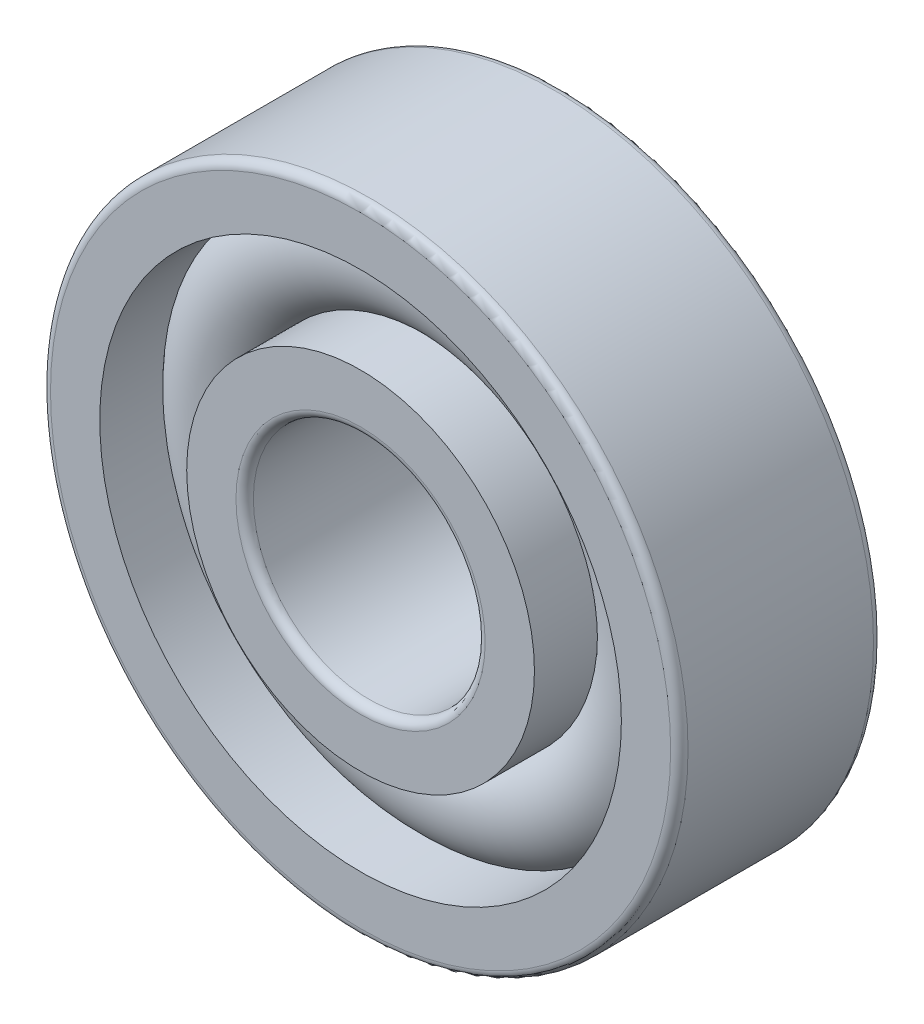
ISO-10303-21;
HEADER;
FILE_DESCRIPTION(('STEP AP214'),'2;1');
FILE_NAME('part.step','',(''),(''),'','','');
FILE_SCHEMA(('AUTOMOTIVE_DESIGN { 1 0 10303 214 1 1 1 1 }'));
ENDSEC;
DATA;
#1=APPLICATION_CONTEXT('core data for automotive mechanical design processes');
#2=APPLICATION_PROTOCOL_DEFINITION('international standard','automotive_design',2000,#1);
#3=PRODUCT_CONTEXT('',#1,'mechanical');
#4=PRODUCT('Part','Part','',(#3));
#5=PRODUCT_RELATED_PRODUCT_CATEGORY('part','',(#4));
#6=PRODUCT_DEFINITION_FORMATION('','',#4);
#7=PRODUCT_DEFINITION_CONTEXT('part definition',#1,'design');
#8=PRODUCT_DEFINITION('design','',#6,#7);
#9=PRODUCT_DEFINITION_SHAPE('','',#8);
#10=(LENGTH_UNIT() NAMED_UNIT(*) SI_UNIT(.MILLI.,.METRE.));
#11=(NAMED_UNIT(*) PLANE_ANGLE_UNIT() SI_UNIT($,.RADIAN.));
#12=(NAMED_UNIT(*) SI_UNIT($,.STERADIAN.) SOLID_ANGLE_UNIT());
#13=UNCERTAINTY_MEASURE_WITH_UNIT(LENGTH_MEASURE(1.E-05),#10,'distance_accuracy_value','');
#14=(GEOMETRIC_REPRESENTATION_CONTEXT(3) GLOBAL_UNCERTAINTY_ASSIGNED_CONTEXT((#13)) GLOBAL_UNIT_ASSIGNED_CONTEXT((#10,
#11,#12)) REPRESENTATION_CONTEXT('',''));
#15=CARTESIAN_POINT('',(0.,0.,0.));
#16=DIRECTION('',(0.,0.,1.));
#17=DIRECTION('',(1.,0.,0.));
#18=AXIS2_PLACEMENT_3D('',#15,#16,#17);
#19=CARTESIAN_POINT('',(0.,0.,0.));
#20=DIRECTION('',(0.,0.,1.));
#21=DIRECTION('',(1.,0.,0.));
#22=AXIS2_PLACEMENT_3D('',#19,#20,#21);
#23=CYLINDRICAL_SURFACE('',#22,6.);
#24=CARTESIAN_POINT('',(0.,0.,3.5));
#25=DIRECTION('',(0.,0.,1.));
#26=DIRECTION('',(1.,0.,0.));
#27=AXIS2_PLACEMENT_3D('',#24,#25,#26);
#28=CIRCLE('',#27,6.);
#29=CARTESIAN_POINT('',(6.,0.,3.5));
#30=VERTEX_POINT('',#29);
#31=EDGE_CURVE('E10',#30,#30,#28,.T.);
#32=ORIENTED_EDGE('',*,*,#31,.F.);
#33=EDGE_LOOP('',(#32));
#34=FACE_BOUND('',#33,.T.);
#35=CARTESIAN_POINT('',(0.,0.,1.3228756555323));
#36=DIRECTION('',(0.,0.,1.));
#37=DIRECTION('',(1.,0.,0.));
#38=AXIS2_PLACEMENT_3D('',#35,#36,#37);
#39=CIRCLE('',#38,6.);
#40=CARTESIAN_POINT('',(6.,0.,1.3228756555323));
#41=VERTEX_POINT('',#40);
#42=EDGE_CURVE('E91',#41,#41,#39,.T.);
#43=ORIENTED_EDGE('',*,*,#42,.T.);
#44=EDGE_LOOP('',(#43));
#45=FACE_BOUND('',#44,.T.);
#46=ADVANCED_FACE('F35',(#34,#45),#23,.T.);
#47=CARTESIAN_POINT('',(0.,6.,3.5));
#48=DIRECTION('',(0.,0.,-1.));
#49=DIRECTION('',(-1.,0.,0.));
#50=AXIS2_PLACEMENT_3D('',#47,#48,#49);
#51=PLANE('',#50);
#52=CARTESIAN_POINT('',(0.,0.,3.5));
#53=DIRECTION('',(0.,0.,1.));
#54=DIRECTION('',(1.,0.,0.));
#55=AXIS2_PLACEMENT_3D('',#52,#53,#54);
#56=CIRCLE('',#55,4.3);
#57=CARTESIAN_POINT('',(4.3,0.,3.5));
#58=VERTEX_POINT('',#57);
#59=EDGE_CURVE('E41',#58,#58,#56,.T.);
#60=ORIENTED_EDGE('',*,*,#59,.F.);
#61=EDGE_LOOP('',(#60));
#62=FACE_BOUND('',#61,.T.);
#63=ORIENTED_EDGE('',*,*,#31,.T.);
#64=EDGE_LOOP('',(#63));
#65=FACE_BOUND('',#64,.T.);
#66=ADVANCED_FACE('F176',(#62,#65),#51,.F.);
#67=CARTESIAN_POINT('',(0.,0.,3.2));
#68=DIRECTION('',(0.,0.,1.));
#69=DIRECTION('',(1.,0.,0.));
#70=AXIS2_PLACEMENT_3D('',#67,#68,#69);
#71=TOROIDAL_SURFACE('',#70,4.3,0.3);
#72=CARTESIAN_POINT('',(0.,0.,3.2));
#73=DIRECTION('',(0.,0.,1.));
#74=DIRECTION('',(1.,0.,0.));
#75=AXIS2_PLACEMENT_3D('',#72,#73,#74);
#76=CIRCLE('',#75,4.);
#77=CARTESIAN_POINT('',(4.,0.,3.2));
#78=VERTEX_POINT('',#77);
#79=EDGE_CURVE('E45',#78,#78,#76,.T.);
#80=ORIENTED_EDGE('',*,*,#79,.F.);
#81=EDGE_LOOP('',(#80));
#82=FACE_BOUND('',#81,.T.);
#83=ORIENTED_EDGE('',*,*,#59,.T.);
#84=EDGE_LOOP('',(#83));
#85=FACE_BOUND('',#84,.T.);
#86=ADVANCED_FACE('F171',(#82,#85),#71,.T.);
#87=CARTESIAN_POINT('',(0.,0.,0.));
#88=DIRECTION('',(0.,0.,1.));
#89=DIRECTION('',(1.,0.,0.));
#90=AXIS2_PLACEMENT_3D('',#87,#88,#89);
#91=CYLINDRICAL_SURFACE('',#90,4.);
#92=CARTESIAN_POINT('',(0.,0.,-3.2));
#93=DIRECTION('',(0.,0.,1.));
#94=DIRECTION('',(1.,0.,0.));
#95=AXIS2_PLACEMENT_3D('',#92,#93,#94);
#96=CIRCLE('',#95,4.);
#97=CARTESIAN_POINT('',(4.,0.,-3.2));
#98=VERTEX_POINT('',#97);
#99=EDGE_CURVE('E49',#98,#98,#96,.T.);
#100=ORIENTED_EDGE('',*,*,#99,.F.);
#101=EDGE_LOOP('',(#100));
#102=FACE_BOUND('',#101,.T.);
#103=ORIENTED_EDGE('',*,*,#79,.T.);
#104=EDGE_LOOP('',(#103));
#105=FACE_BOUND('',#104,.T.);
#106=ADVANCED_FACE('F165',(#102,#105),#91,.F.);
#107=CARTESIAN_POINT('',(0.,0.,-3.2));
#108=DIRECTION('',(0.,0.,1.));
#109=DIRECTION('',(1.,0.,0.));
#110=AXIS2_PLACEMENT_3D('',#107,#108,#109);
#111=TOROIDAL_SURFACE('',#110,4.3,0.3);
#112=CARTESIAN_POINT('',(0.,0.,-3.5));
#113=DIRECTION('',(0.,0.,1.));
#114=DIRECTION('',(1.,0.,0.));
#115=AXIS2_PLACEMENT_3D('',#112,#113,#114);
#116=CIRCLE('',#115,4.3);
#117=CARTESIAN_POINT('',(4.3,0.,-3.5));
#118=VERTEX_POINT('',#117);
#119=EDGE_CURVE('E54',#118,#118,#116,.T.);
#120=ORIENTED_EDGE('',*,*,#119,.F.);
#121=EDGE_LOOP('',(#120));
#122=FACE_BOUND('',#121,.T.);
#123=ORIENTED_EDGE('',*,*,#99,.T.);
#124=EDGE_LOOP('',(#123));
#125=FACE_BOUND('',#124,.T.);
#126=ADVANCED_FACE('F159',(#122,#125),#111,.T.);
#127=CARTESIAN_POINT('',(0.,4.3,-3.5));
#128=DIRECTION('',(0.,0.,1.));
#129=DIRECTION('',(1.,0.,0.));
#130=AXIS2_PLACEMENT_3D('',#127,#128,#129);
#131=PLANE('',#130);
#132=CARTESIAN_POINT('',(0.,0.,-3.5));
#133=DIRECTION('',(0.,0.,1.));
#134=DIRECTION('',(1.,0.,0.));
#135=AXIS2_PLACEMENT_3D('',#132,#133,#134);
#136=CIRCLE('',#135,6.);
#137=CARTESIAN_POINT('',(6.,0.,-3.5));
#138=VERTEX_POINT('',#137);
#139=EDGE_CURVE('E57',#138,#138,#136,.T.);
#140=ORIENTED_EDGE('',*,*,#139,.F.);
#141=EDGE_LOOP('',(#140));
#142=FACE_BOUND('',#141,.T.);
#143=ORIENTED_EDGE('',*,*,#119,.T.);
#144=EDGE_LOOP('',(#143));
#145=FACE_BOUND('',#144,.T.);
#146=ADVANCED_FACE('F153',(#142,#145),#131,.F.);
#147=CARTESIAN_POINT('',(0.,0.,0.));
#148=DIRECTION('',(0.,0.,1.));
#149=DIRECTION('',(1.,0.,0.));
#150=AXIS2_PLACEMENT_3D('',#147,#148,#149);
#151=CYLINDRICAL_SURFACE('',#150,6.);
#152=CARTESIAN_POINT('',(0.,0.,-1.3228756555323));
#153=DIRECTION('',(0.,0.,1.));
#154=DIRECTION('',(1.,0.,0.));
#155=AXIS2_PLACEMENT_3D('',#152,#153,#154);
#156=CIRCLE('',#155,6.);
#157=CARTESIAN_POINT('',(6.,0.,-1.3228756555323));
#158=VERTEX_POINT('',#157);
#159=EDGE_CURVE('E60',#158,#158,#156,.T.);
#160=ORIENTED_EDGE('',*,*,#159,.F.);
#161=EDGE_LOOP('',(#160));
#162=FACE_BOUND('',#161,.T.);
#163=ORIENTED_EDGE('',*,*,#139,.T.);
#164=EDGE_LOOP('',(#163));
#165=FACE_BOUND('',#164,.T.);
#166=ADVANCED_FACE('F147',(#162,#165),#151,.T.);
#167=CARTESIAN_POINT('',(0.,0.,0.));
#168=DIRECTION('',(0.,0.,1.));
#169=DIRECTION('',(1.,0.,0.));
#170=AXIS2_PLACEMENT_3D('',#167,#168,#169);
#171=TOROIDAL_SURFACE('',#170,7.5,2.);
#172=CARTESIAN_POINT('',(0.,0.,-1.3228756555323));
#173=DIRECTION('',(0.,0.,1.));
#174=DIRECTION('',(1.,0.,0.));
#175=AXIS2_PLACEMENT_3D('',#172,#173,#174);
#176=CIRCLE('',#175,9.);
#177=CARTESIAN_POINT('',(9.,0.,-1.3228756555323));
#178=VERTEX_POINT('',#177);
#179=EDGE_CURVE('E63',#178,#178,#176,.T.);
#180=ORIENTED_EDGE('',*,*,#179,.F.);
#181=EDGE_LOOP('',(#180));
#182=FACE_BOUND('',#181,.T.);
#183=ORIENTED_EDGE('',*,*,#159,.T.);
#184=EDGE_LOOP('',(#183));
#185=FACE_BOUND('',#184,.T.);
#186=ADVANCED_FACE('F141',(#182,#185),#171,.T.);
#187=CARTESIAN_POINT('',(0.,0.,0.));
#188=DIRECTION('',(0.,0.,1.));
#189=DIRECTION('',(1.,0.,0.));
#190=AXIS2_PLACEMENT_3D('',#187,#188,#189);
#191=CYLINDRICAL_SURFACE('',#190,9.);
#192=CARTESIAN_POINT('',(0.,0.,-3.5));
#193=DIRECTION('',(0.,0.,1.));
#194=DIRECTION('',(1.,0.,0.));
#195=AXIS2_PLACEMENT_3D('',#192,#193,#194);
#196=CIRCLE('',#195,9.);
#197=CARTESIAN_POINT('',(9.,0.,-3.5));
#198=VERTEX_POINT('',#197);
#199=EDGE_CURVE('E67',#198,#198,#196,.T.);
#200=ORIENTED_EDGE('',*,*,#199,.F.);
#201=EDGE_LOOP('',(#200));
#202=FACE_BOUND('',#201,.T.);
#203=ORIENTED_EDGE('',*,*,#179,.T.);
#204=EDGE_LOOP('',(#203));
#205=FACE_BOUND('',#204,.T.);
#206=ADVANCED_FACE('F135',(#202,#205),#191,.F.);
#207=CARTESIAN_POINT('',(0.,10.7,-3.5));
#208=DIRECTION('',(0.,0.,1.));
#209=DIRECTION('',(1.,0.,0.));
#210=AXIS2_PLACEMENT_3D('',#207,#208,#209);
#211=PLANE('',#210);
#212=CARTESIAN_POINT('',(0.,0.,-3.5));
#213=DIRECTION('',(0.,0.,1.));
#214=DIRECTION('',(1.,0.,0.));
#215=AXIS2_PLACEMENT_3D('',#212,#213,#214);
#216=CIRCLE('',#215,10.7);
#217=CARTESIAN_POINT('',(10.7,0.,-3.5));
#218=VERTEX_POINT('',#217);
#219=EDGE_CURVE('E71',#218,#218,#216,.T.);
#220=ORIENTED_EDGE('',*,*,#219,.F.);
#221=EDGE_LOOP('',(#220));
#222=FACE_BOUND('',#221,.T.);
#223=ORIENTED_EDGE('',*,*,#199,.T.);
#224=EDGE_LOOP('',(#223));
#225=FACE_BOUND('',#224,.T.);
#226=ADVANCED_FACE('F129',(#222,#225),#211,.F.);
#227=CARTESIAN_POINT('',(0.,0.,-3.2));
#228=DIRECTION('',(0.,0.,1.));
#229=DIRECTION('',(1.,0.,0.));
#230=AXIS2_PLACEMENT_3D('',#227,#228,#229);
#231=TOROIDAL_SURFACE('',#230,10.7,0.3);
#232=CARTESIAN_POINT('',(0.,0.,-3.2));
#233=DIRECTION('',(0.,0.,1.));
#234=DIRECTION('',(1.,0.,0.));
#235=AXIS2_PLACEMENT_3D('',#232,#233,#234);
#236=CIRCLE('',#235,11.);
#237=CARTESIAN_POINT('',(11.,0.,-3.2));
#238=VERTEX_POINT('',#237);
#239=EDGE_CURVE('E75',#238,#238,#236,.T.);
#240=ORIENTED_EDGE('',*,*,#239,.F.);
#241=EDGE_LOOP('',(#240));
#242=FACE_BOUND('',#241,.T.);
#243=ORIENTED_EDGE('',*,*,#219,.T.);
#244=EDGE_LOOP('',(#243));
#245=FACE_BOUND('',#244,.T.);
#246=ADVANCED_FACE('F123',(#242,#245),#231,.T.);
#247=CARTESIAN_POINT('',(0.,0.,0.));
#248=DIRECTION('',(0.,0.,1.));
#249=DIRECTION('',(1.,0.,0.));
#250=AXIS2_PLACEMENT_3D('',#247,#248,#249);
#251=CYLINDRICAL_SURFACE('',#250,11.);
#252=CARTESIAN_POINT('',(0.,0.,3.2));
#253=DIRECTION('',(0.,0.,1.));
#254=DIRECTION('',(1.,0.,0.));
#255=AXIS2_PLACEMENT_3D('',#252,#253,#254);
#256=CIRCLE('',#255,11.);
#257=CARTESIAN_POINT('',(11.,0.,3.2));
#258=VERTEX_POINT('',#257);
#259=EDGE_CURVE('E79',#258,#258,#256,.T.);
#260=ORIENTED_EDGE('',*,*,#259,.F.);
#261=EDGE_LOOP('',(#260));
#262=FACE_BOUND('',#261,.T.);
#263=ORIENTED_EDGE('',*,*,#239,.T.);
#264=EDGE_LOOP('',(#263));
#265=FACE_BOUND('',#264,.T.);
#266=ADVANCED_FACE('F117',(#262,#265),#251,.T.);
#267=CARTESIAN_POINT('',(0.,0.,3.2));
#268=DIRECTION('',(0.,0.,1.));
#269=DIRECTION('',(1.,0.,0.));
#270=AXIS2_PLACEMENT_3D('',#267,#268,#269);
#271=TOROIDAL_SURFACE('',#270,10.7,0.3);
#272=CARTESIAN_POINT('',(0.,0.,3.5));
#273=DIRECTION('',(0.,0.,1.));
#274=DIRECTION('',(1.,0.,0.));
#275=AXIS2_PLACEMENT_3D('',#272,#273,#274);
#276=CIRCLE('',#275,10.7);
#277=CARTESIAN_POINT('',(10.7,0.,3.5));
#278=VERTEX_POINT('',#277);
#279=EDGE_CURVE('E82',#278,#278,#276,.T.);
#280=ORIENTED_EDGE('',*,*,#279,.F.);
#281=EDGE_LOOP('',(#280));
#282=FACE_BOUND('',#281,.T.);
#283=ORIENTED_EDGE('',*,*,#259,.T.);
#284=EDGE_LOOP('',(#283));
#285=FACE_BOUND('',#284,.T.);
#286=ADVANCED_FACE('F111',(#282,#285),#271,.T.);
#287=CARTESIAN_POINT('',(0.,9.,3.5));
#288=DIRECTION('',(0.,0.,-1.));
#289=DIRECTION('',(-1.,0.,0.));
#290=AXIS2_PLACEMENT_3D('',#287,#288,#289);
#291=PLANE('',#290);
#292=CARTESIAN_POINT('',(0.,0.,3.5));
#293=DIRECTION('',(0.,0.,1.));
#294=DIRECTION('',(1.,0.,0.));
#295=AXIS2_PLACEMENT_3D('',#292,#293,#294);
#296=CIRCLE('',#295,9.);
#297=CARTESIAN_POINT('',(9.,0.,3.5));
#298=VERTEX_POINT('',#297);
#299=EDGE_CURVE('E85',#298,#298,#296,.T.);
#300=ORIENTED_EDGE('',*,*,#299,.F.);
#301=EDGE_LOOP('',(#300));
#302=FACE_BOUND('',#301,.T.);
#303=ORIENTED_EDGE('',*,*,#279,.T.);
#304=EDGE_LOOP('',(#303));
#305=FACE_BOUND('',#304,.T.);
#306=ADVANCED_FACE('F105',(#302,#305),#291,.F.);
#307=CARTESIAN_POINT('',(0.,0.,0.));
#308=DIRECTION('',(0.,0.,1.));
#309=DIRECTION('',(1.,0.,0.));
#310=AXIS2_PLACEMENT_3D('',#307,#308,#309);
#311=CYLINDRICAL_SURFACE('',#310,9.);
#312=CARTESIAN_POINT('',(0.,0.,1.3228756555323));
#313=DIRECTION('',(0.,0.,1.));
#314=DIRECTION('',(1.,0.,0.));
#315=AXIS2_PLACEMENT_3D('',#312,#313,#314);
#316=CIRCLE('',#315,9.);
#317=CARTESIAN_POINT('',(9.,0.,1.3228756555323));
#318=VERTEX_POINT('',#317);
#319=EDGE_CURVE('E88',#318,#318,#316,.T.);
#320=ORIENTED_EDGE('',*,*,#319,.F.);
#321=EDGE_LOOP('',(#320));
#322=FACE_BOUND('',#321,.T.);
#323=ORIENTED_EDGE('',*,*,#299,.T.);
#324=EDGE_LOOP('',(#323));
#325=FACE_BOUND('',#324,.T.);
#326=ADVANCED_FACE('F99',(#322,#325),#311,.F.);
#327=CARTESIAN_POINT('',(0.,0.,0.));
#328=DIRECTION('',(0.,0.,1.));
#329=DIRECTION('',(1.,0.,0.));
#330=AXIS2_PLACEMENT_3D('',#327,#328,#329);
#331=TOROIDAL_SURFACE('',#330,7.5,2.);
#332=ORIENTED_EDGE('',*,*,#42,.F.);
#333=EDGE_LOOP('',(#332));
#334=FACE_BOUND('',#333,.T.);
#335=ORIENTED_EDGE('',*,*,#319,.T.);
#336=EDGE_LOOP('',(#335));
#337=FACE_BOUND('',#336,.T.);
#338=ADVANCED_FACE('F96',(#334,#337),#331,.T.);
#339=CLOSED_SHELL('',(#46,#66,#86,#106,#126,#146,#166,#186,#206,#226,#246,#266,#286,#306,#326,#338));
#340=MANIFOLD_SOLID_BREP('B2',#339);
#341=ADVANCED_BREP_SHAPE_REPRESENTATION('',(#18,#340),#14);
#342=SHAPE_DEFINITION_REPRESENTATION(#9,#341);
ENDSEC;
END-ISO-10303-21;
